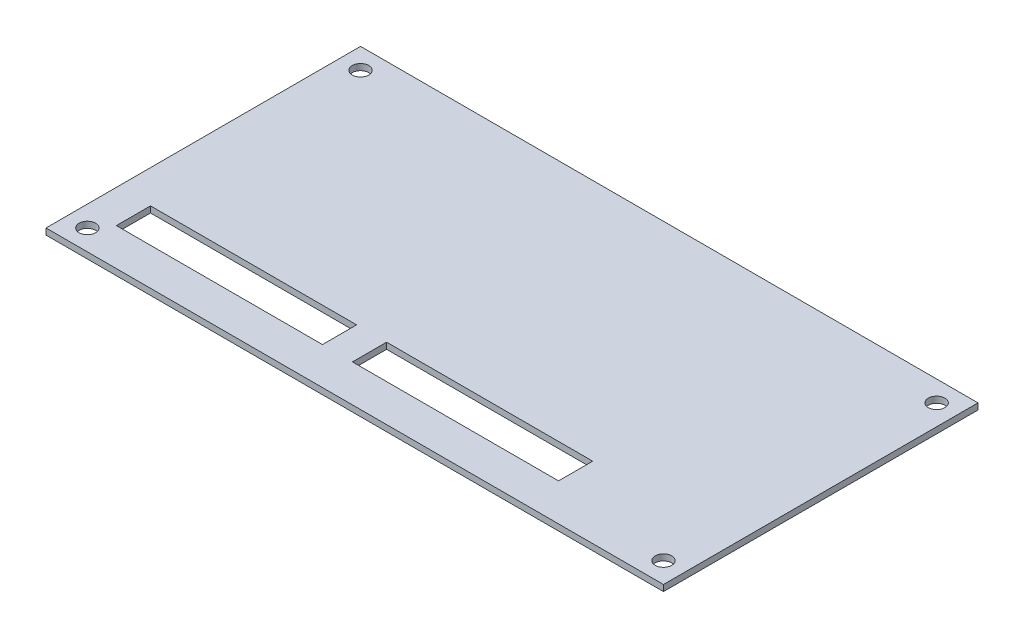
ISO-10303-21;
HEADER;
FILE_DESCRIPTION(('STEP AP214'),'2;1');
FILE_NAME('part.step','',(''),(''),'','','');
FILE_SCHEMA(('AUTOMOTIVE_DESIGN { 1 0 10303 214 1 1 1 1 }'));
ENDSEC;
DATA;
#1=APPLICATION_CONTEXT('core data for automotive mechanical design processes');
#2=APPLICATION_PROTOCOL_DEFINITION('international standard','automotive_design',2000,#1);
#3=PRODUCT_CONTEXT('',#1,'mechanical');
#4=PRODUCT('Part','Part','',(#3));
#5=PRODUCT_RELATED_PRODUCT_CATEGORY('part','',(#4));
#6=PRODUCT_DEFINITION_FORMATION('','',#4);
#7=PRODUCT_DEFINITION_CONTEXT('part definition',#1,'design');
#8=PRODUCT_DEFINITION('design','',#6,#7);
#9=PRODUCT_DEFINITION_SHAPE('','',#8);
#10=(LENGTH_UNIT() NAMED_UNIT(*) SI_UNIT(.MILLI.,.METRE.));
#11=(NAMED_UNIT(*) PLANE_ANGLE_UNIT() SI_UNIT($,.RADIAN.));
#12=(NAMED_UNIT(*) SI_UNIT($,.STERADIAN.) SOLID_ANGLE_UNIT());
#13=UNCERTAINTY_MEASURE_WITH_UNIT(LENGTH_MEASURE(1.E-05),#10,'distance_accuracy_value','');
#14=(GEOMETRIC_REPRESENTATION_CONTEXT(3) GLOBAL_UNCERTAINTY_ASSIGNED_CONTEXT((#13)) GLOBAL_UNIT_ASSIGNED_CONTEXT((#10,
#11,#12)) REPRESENTATION_CONTEXT('',''));
#15=CARTESIAN_POINT('',(0.,0.,0.));
#16=DIRECTION('',(0.,0.,1.));
#17=DIRECTION('',(1.,0.,0.));
#18=AXIS2_PLACEMENT_3D('',#15,#16,#17);
#19=CARTESIAN_POINT('',(74.6,-1.5,38.));
#20=DIRECTION('',(1.,0.,0.));
#21=DIRECTION('',(0.,0.,-1.));
#22=AXIS2_PLACEMENT_3D('',#19,#20,#21);
#23=PLANE('',#22);
#24=DIRECTION('',(0.,0.,-1.));
#25=VECTOR('',#24,1.);
#26=CARTESIAN_POINT('',(74.6,0.,38.));
#27=LINE('',#26,#25);
#28=CARTESIAN_POINT('',(74.6,0.,38.));
#29=VERTEX_POINT('',#28);
#30=CARTESIAN_POINT('',(74.6,0.,-38.));
#31=VERTEX_POINT('',#30);
#32=EDGE_CURVE('E254',#29,#31,#27,.T.);
#33=ORIENTED_EDGE('',*,*,#32,.F.);
#34=DIRECTION('',(0.,1.,0.));
#35=VECTOR('',#34,1.);
#36=CARTESIAN_POINT('',(74.6,-1.5,38.));
#37=LINE('',#36,#35);
#38=CARTESIAN_POINT('',(74.6,-1.5,38.));
#39=VERTEX_POINT('',#38);
#40=EDGE_CURVE('E11',#39,#29,#37,.T.);
#41=ORIENTED_EDGE('',*,*,#40,.F.);
#42=DIRECTION('',(0.,0.,-1.));
#43=VECTOR('',#42,1.);
#44=CARTESIAN_POINT('',(74.6,-1.5,38.));
#45=LINE('',#44,#43);
#46=CARTESIAN_POINT('',(74.6,-1.5,-38.));
#47=VERTEX_POINT('',#46);
#48=EDGE_CURVE('E258',#39,#47,#45,.T.);
#49=ORIENTED_EDGE('',*,*,#48,.T.);
#50=DIRECTION('',(0.,1.,0.));
#51=VECTOR('',#50,1.);
#52=CARTESIAN_POINT('',(74.6,-1.5,-38.));
#53=LINE('',#52,#51);
#54=EDGE_CURVE('E46',#47,#31,#53,.T.);
#55=ORIENTED_EDGE('',*,*,#54,.T.);
#56=EDGE_LOOP('',(#33,#41,#49,#55));
#57=FACE_BOUND('',#56,.T.);
#58=ADVANCED_FACE('F43',(#57),#23,.T.);
#59=CARTESIAN_POINT('',(-74.6,-1.5,38.));
#60=DIRECTION('',(0.,0.,1.));
#61=DIRECTION('',(1.,0.,0.));
#62=AXIS2_PLACEMENT_3D('',#59,#60,#61);
#63=PLANE('',#62);
#64=DIRECTION('',(1.,0.,0.));
#65=VECTOR('',#64,1.);
#66=CARTESIAN_POINT('',(-74.6,0.,38.));
#67=LINE('',#66,#65);
#68=CARTESIAN_POINT('',(-74.6,0.,38.));
#69=VERTEX_POINT('',#68);
#70=EDGE_CURVE('E263',#69,#29,#67,.T.);
#71=ORIENTED_EDGE('',*,*,#70,.F.);
#72=DIRECTION('',(0.,1.,0.));
#73=VECTOR('',#72,1.);
#74=CARTESIAN_POINT('',(-74.6,-1.5,38.));
#75=LINE('',#74,#73);
#76=CARTESIAN_POINT('',(-74.6,-1.5,38.));
#77=VERTEX_POINT('',#76);
#78=EDGE_CURVE('E52',#77,#69,#75,.T.);
#79=ORIENTED_EDGE('',*,*,#78,.F.);
#80=DIRECTION('',(1.,0.,0.));
#81=VECTOR('',#80,1.);
#82=CARTESIAN_POINT('',(-74.6,-1.5,38.));
#83=LINE('',#82,#81);
#84=EDGE_CURVE('E271',#77,#39,#83,.T.);
#85=ORIENTED_EDGE('',*,*,#84,.T.);
#86=ORIENTED_EDGE('',*,*,#40,.T.);
#87=EDGE_LOOP('',(#71,#79,#85,#86));
#88=FACE_BOUND('',#87,.T.);
#89=ADVANCED_FACE('F305',(#88),#63,.T.);
#90=CARTESIAN_POINT('',(-74.6,-1.5,38.));
#91=DIRECTION('',(-1.,0.,0.));
#92=DIRECTION('',(0.,0.,1.));
#93=AXIS2_PLACEMENT_3D('',#90,#91,#92);
#94=PLANE('',#93);
#95=DIRECTION('',(0.,0.,1.));
#96=VECTOR('',#95,1.);
#97=CARTESIAN_POINT('',(-74.6,0.,38.));
#98=LINE('',#97,#96);
#99=CARTESIAN_POINT('',(-74.6,0.,-38.));
#100=VERTEX_POINT('',#99);
#101=EDGE_CURVE('E282',#100,#69,#98,.T.);
#102=ORIENTED_EDGE('',*,*,#101,.F.);
#103=DIRECTION('',(0.,1.,0.));
#104=VECTOR('',#103,1.);
#105=CARTESIAN_POINT('',(-74.6,-1.5,-38.));
#106=LINE('',#105,#104);
#107=CARTESIAN_POINT('',(-74.6,-1.5,-38.));
#108=VERTEX_POINT('',#107);
#109=EDGE_CURVE('E290',#108,#100,#106,.T.);
#110=ORIENTED_EDGE('',*,*,#109,.F.);
#111=DIRECTION('',(0.,0.,1.));
#112=VECTOR('',#111,1.);
#113=CARTESIAN_POINT('',(-74.6,-1.5,38.));
#114=LINE('',#113,#112);
#115=EDGE_CURVE('E267',#108,#77,#114,.T.);
#116=ORIENTED_EDGE('',*,*,#115,.T.);
#117=ORIENTED_EDGE('',*,*,#78,.T.);
#118=EDGE_LOOP('',(#102,#110,#116,#117));
#119=FACE_BOUND('',#118,.T.);
#120=ADVANCED_FACE('F310',(#119),#94,.T.);
#121=CARTESIAN_POINT('',(-74.6,-1.5,-38.));
#122=DIRECTION('',(0.,0.,-1.));
#123=DIRECTION('',(-1.,0.,0.));
#124=AXIS2_PLACEMENT_3D('',#121,#122,#123);
#125=PLANE('',#124);
#126=DIRECTION('',(-1.,0.,0.));
#127=VECTOR('',#126,1.);
#128=CARTESIAN_POINT('',(-74.6,0.,-38.));
#129=LINE('',#128,#127);
#130=EDGE_CURVE('E278',#31,#100,#129,.T.);
#131=ORIENTED_EDGE('',*,*,#130,.F.);
#132=ORIENTED_EDGE('',*,*,#54,.F.);
#133=DIRECTION('',(-1.,0.,0.));
#134=VECTOR('',#133,1.);
#135=CARTESIAN_POINT('',(-74.6,-1.5,-38.));
#136=LINE('',#135,#134);
#137=EDGE_CURVE('E262',#47,#108,#136,.T.);
#138=ORIENTED_EDGE('',*,*,#137,.T.);
#139=ORIENTED_EDGE('',*,*,#109,.T.);
#140=EDGE_LOOP('',(#131,#132,#138,#139));
#141=FACE_BOUND('',#140,.T.);
#142=ADVANCED_FACE('F300',(#141),#125,.T.);
#143=CARTESIAN_POINT('',(0.,-1.5,0.));
#144=DIRECTION('',(0.,-1.,0.));
#145=DIRECTION('',(0.,0.,-1.));
#146=AXIS2_PLACEMENT_3D('',#143,#144,#145);
#147=PLANE('',#146);
#148=DIRECTION('',(0.,0.,-1.));
#149=VECTOR('',#148,1.);
#150=CARTESIAN_POINT('',(40.25,-1.5,29.));
#151=LINE('',#150,#149);
#152=CARTESIAN_POINT('',(40.25,-1.5,29.));
#153=VERTEX_POINT('',#152);
#154=CARTESIAN_POINT('',(40.25,-1.5,20.75));
#155=VERTEX_POINT('',#154);
#156=EDGE_CURVE('E135',#153,#155,#151,.T.);
#157=ORIENTED_EDGE('',*,*,#156,.T.);
#158=DIRECTION('',(-1.,0.,0.));
#159=VECTOR('',#158,1.);
#160=CARTESIAN_POINT('',(-9.55,-1.5,20.75));
#161=LINE('',#160,#159);
#162=CARTESIAN_POINT('',(-9.55,-1.5,20.75));
#163=VERTEX_POINT('',#162);
#164=EDGE_CURVE('E145',#155,#163,#161,.T.);
#165=ORIENTED_EDGE('',*,*,#164,.T.);
#166=DIRECTION('',(0.,0.,1.));
#167=VECTOR('',#166,1.);
#168=CARTESIAN_POINT('',(-9.55,-1.5,29.));
#169=LINE('',#168,#167);
#170=CARTESIAN_POINT('',(-9.55,-1.5,29.));
#171=VERTEX_POINT('',#170);
#172=EDGE_CURVE('E60',#163,#171,#169,.T.);
#173=ORIENTED_EDGE('',*,*,#172,.T.);
#174=DIRECTION('',(1.,0.,0.));
#175=VECTOR('',#174,1.);
#176=CARTESIAN_POINT('',(-9.55,-1.5,29.));
#177=LINE('',#176,#175);
#178=EDGE_CURVE('E142',#171,#153,#177,.T.);
#179=ORIENTED_EDGE('',*,*,#178,.T.);
#180=EDGE_LOOP('',(#157,#165,#173,#179));
#181=FACE_BOUND('',#180,.T.);
#182=DIRECTION('',(0.,0.,-1.));
#183=VECTOR('',#182,1.);
#184=CARTESIAN_POINT('',(-16.8,-1.5,29.));
#185=LINE('',#184,#183);
#186=CARTESIAN_POINT('',(-16.8,-1.5,29.));
#187=VERTEX_POINT('',#186);
#188=CARTESIAN_POINT('',(-16.8,-1.5,20.75));
#189=VERTEX_POINT('',#188);
#190=EDGE_CURVE('E182',#187,#189,#185,.T.);
#191=ORIENTED_EDGE('',*,*,#190,.T.);
#192=DIRECTION('',(-1.,0.,0.));
#193=VECTOR('',#192,1.);
#194=CARTESIAN_POINT('',(-66.6,-1.5,20.75));
#195=LINE('',#194,#193);
#196=CARTESIAN_POINT('',(-66.6,-1.5,20.75));
#197=VERTEX_POINT('',#196);
#198=EDGE_CURVE('E186',#189,#197,#195,.T.);
#199=ORIENTED_EDGE('',*,*,#198,.T.);
#200=DIRECTION('',(0.,0.,1.));
#201=VECTOR('',#200,1.);
#202=CARTESIAN_POINT('',(-66.6,-1.5,29.));
#203=LINE('',#202,#201);
#204=CARTESIAN_POINT('',(-66.6,-1.5,29.));
#205=VERTEX_POINT('',#204);
#206=EDGE_CURVE('E191',#197,#205,#203,.T.);
#207=ORIENTED_EDGE('',*,*,#206,.T.);
#208=DIRECTION('',(1.,0.,0.));
#209=VECTOR('',#208,1.);
#210=CARTESIAN_POINT('',(-66.6,-1.5,29.));
#211=LINE('',#210,#209);
#212=EDGE_CURVE('E195',#205,#187,#211,.T.);
#213=ORIENTED_EDGE('',*,*,#212,.T.);
#214=EDGE_LOOP('',(#191,#199,#207,#213));
#215=FACE_BOUND('',#214,.T.);
#216=CARTESIAN_POINT('',(-69.6,-1.5,33.));
#217=DIRECTION('',(0.,1.,0.));
#218=DIRECTION('',(0.,0.,1.));
#219=AXIS2_PLACEMENT_3D('',#216,#217,#218);
#220=CIRCLE('',#219,2.);
#221=CARTESIAN_POINT('',(-69.6,-1.5,35.));
#222=VERTEX_POINT('',#221);
#223=EDGE_CURVE('E226',#222,#222,#220,.T.);
#224=ORIENTED_EDGE('',*,*,#223,.T.);
#225=EDGE_LOOP('',(#224));
#226=FACE_BOUND('',#225,.T.);
#227=CARTESIAN_POINT('',(69.6,-1.5,33.));
#228=DIRECTION('',(0.,1.,0.));
#229=DIRECTION('',(0.,0.,1.));
#230=AXIS2_PLACEMENT_3D('',#227,#228,#229);
#231=CIRCLE('',#230,2.);
#232=CARTESIAN_POINT('',(69.6,-1.5,35.));
#233=VERTEX_POINT('',#232);
#234=EDGE_CURVE('E234',#233,#233,#231,.T.);
#235=ORIENTED_EDGE('',*,*,#234,.T.);
#236=EDGE_LOOP('',(#235));
#237=FACE_BOUND('',#236,.T.);
#238=CARTESIAN_POINT('',(69.6,-1.5,-33.));
#239=DIRECTION('',(0.,1.,0.));
#240=DIRECTION('',(0.,0.,1.));
#241=AXIS2_PLACEMENT_3D('',#238,#239,#240);
#242=CIRCLE('',#241,2.);
#243=CARTESIAN_POINT('',(69.6,-1.5,-31.));
#244=VERTEX_POINT('',#243);
#245=EDGE_CURVE('E242',#244,#244,#242,.T.);
#246=ORIENTED_EDGE('',*,*,#245,.T.);
#247=EDGE_LOOP('',(#246));
#248=FACE_BOUND('',#247,.T.);
#249=CARTESIAN_POINT('',(-69.6,-1.5,-33.));
#250=DIRECTION('',(0.,1.,0.));
#251=DIRECTION('',(0.,0.,1.));
#252=AXIS2_PLACEMENT_3D('',#249,#250,#251);
#253=CIRCLE('',#252,2.);
#254=CARTESIAN_POINT('',(-69.6,-1.5,-31.));
#255=VERTEX_POINT('',#254);
#256=EDGE_CURVE('E250',#255,#255,#253,.T.);
#257=ORIENTED_EDGE('',*,*,#256,.T.);
#258=EDGE_LOOP('',(#257));
#259=FACE_BOUND('',#258,.T.);
#260=ORIENTED_EDGE('',*,*,#48,.F.);
#261=ORIENTED_EDGE('',*,*,#84,.F.);
#262=ORIENTED_EDGE('',*,*,#115,.F.);
#263=ORIENTED_EDGE('',*,*,#137,.F.);
#264=EDGE_LOOP('',(#260,#261,#262,#263));
#265=FACE_BOUND('',#264,.T.);
#266=ADVANCED_FACE('F150',(#181,#215,#226,#237,#248,#259,#265),#147,.T.);
#267=CARTESIAN_POINT('',(0.,0.,0.));
#268=DIRECTION('',(0.,-1.,0.));
#269=DIRECTION('',(0.,0.,-1.));
#270=AXIS2_PLACEMENT_3D('',#267,#268,#269);
#271=PLANE('',#270);
#272=DIRECTION('',(-1.,0.,0.));
#273=VECTOR('',#272,1.);
#274=CARTESIAN_POINT('',(-9.55,0.,20.75));
#275=LINE('',#274,#273);
#276=CARTESIAN_POINT('',(40.25,0.,20.75));
#277=VERTEX_POINT('',#276);
#278=CARTESIAN_POINT('',(-9.55,0.,20.75));
#279=VERTEX_POINT('',#278);
#280=EDGE_CURVE('E167',#277,#279,#275,.T.);
#281=ORIENTED_EDGE('',*,*,#280,.F.);
#282=DIRECTION('',(0.,0.,-1.));
#283=VECTOR('',#282,1.);
#284=CARTESIAN_POINT('',(40.25,0.,29.));
#285=LINE('',#284,#283);
#286=CARTESIAN_POINT('',(40.25,0.,29.));
#287=VERTEX_POINT('',#286);
#288=EDGE_CURVE('E68',#287,#277,#285,.T.);
#289=ORIENTED_EDGE('',*,*,#288,.F.);
#290=DIRECTION('',(1.,0.,0.));
#291=VECTOR('',#290,1.);
#292=CARTESIAN_POINT('',(-9.55,0.,29.));
#293=LINE('',#292,#291);
#294=CARTESIAN_POINT('',(-9.55,0.,29.));
#295=VERTEX_POINT('',#294);
#296=EDGE_CURVE('E154',#295,#287,#293,.T.);
#297=ORIENTED_EDGE('',*,*,#296,.F.);
#298=DIRECTION('',(0.,0.,1.));
#299=VECTOR('',#298,1.);
#300=CARTESIAN_POINT('',(-9.55,0.,29.));
#301=LINE('',#300,#299);
#302=EDGE_CURVE('E158',#279,#295,#301,.T.);
#303=ORIENTED_EDGE('',*,*,#302,.F.);
#304=EDGE_LOOP('',(#281,#289,#297,#303));
#305=FACE_BOUND('',#304,.T.);
#306=DIRECTION('',(-1.,0.,0.));
#307=VECTOR('',#306,1.);
#308=CARTESIAN_POINT('',(-66.6,0.,20.75));
#309=LINE('',#308,#307);
#310=CARTESIAN_POINT('',(-16.8,0.,20.75));
#311=VERTEX_POINT('',#310);
#312=CARTESIAN_POINT('',(-66.6,0.,20.75));
#313=VERTEX_POINT('',#312);
#314=EDGE_CURVE('E202',#311,#313,#309,.T.);
#315=ORIENTED_EDGE('',*,*,#314,.F.);
#316=DIRECTION('',(0.,0.,-1.));
#317=VECTOR('',#316,1.);
#318=CARTESIAN_POINT('',(-16.8,0.,29.));
#319=LINE('',#318,#317);
#320=CARTESIAN_POINT('',(-16.8,0.,29.));
#321=VERTEX_POINT('',#320);
#322=EDGE_CURVE('E176',#321,#311,#319,.T.);
#323=ORIENTED_EDGE('',*,*,#322,.F.);
#324=DIRECTION('',(1.,0.,0.));
#325=VECTOR('',#324,1.);
#326=CARTESIAN_POINT('',(-66.6,0.,29.));
#327=LINE('',#326,#325);
#328=CARTESIAN_POINT('',(-66.6,0.,29.));
#329=VERTEX_POINT('',#328);
#330=EDGE_CURVE('E187',#329,#321,#327,.T.);
#331=ORIENTED_EDGE('',*,*,#330,.F.);
#332=DIRECTION('',(0.,0.,1.));
#333=VECTOR('',#332,1.);
#334=CARTESIAN_POINT('',(-66.6,0.,29.));
#335=LINE('',#334,#333);
#336=EDGE_CURVE('E206',#313,#329,#335,.T.);
#337=ORIENTED_EDGE('',*,*,#336,.F.);
#338=EDGE_LOOP('',(#315,#323,#331,#337));
#339=FACE_BOUND('',#338,.T.);
#340=CARTESIAN_POINT('',(-69.6,0.,33.));
#341=DIRECTION('',(0.,1.,0.));
#342=DIRECTION('',(0.,0.,1.));
#343=AXIS2_PLACEMENT_3D('',#340,#341,#342);
#344=CIRCLE('',#343,2.);
#345=CARTESIAN_POINT('',(-69.6,0.,35.));
#346=VERTEX_POINT('',#345);
#347=EDGE_CURVE('E216',#346,#346,#344,.T.);
#348=ORIENTED_EDGE('',*,*,#347,.F.);
#349=EDGE_LOOP('',(#348));
#350=FACE_BOUND('',#349,.T.);
#351=CARTESIAN_POINT('',(69.6,0.,33.));
#352=DIRECTION('',(0.,1.,0.));
#353=DIRECTION('',(0.,0.,1.));
#354=AXIS2_PLACEMENT_3D('',#351,#352,#353);
#355=CIRCLE('',#354,2.);
#356=CARTESIAN_POINT('',(69.6,0.,35.));
#357=VERTEX_POINT('',#356);
#358=EDGE_CURVE('E230',#357,#357,#355,.T.);
#359=ORIENTED_EDGE('',*,*,#358,.F.);
#360=EDGE_LOOP('',(#359));
#361=FACE_BOUND('',#360,.T.);
#362=CARTESIAN_POINT('',(69.6,0.,-33.));
#363=DIRECTION('',(0.,1.,0.));
#364=DIRECTION('',(0.,0.,1.));
#365=AXIS2_PLACEMENT_3D('',#362,#363,#364);
#366=CIRCLE('',#365,2.);
#367=CARTESIAN_POINT('',(69.6,0.,-31.));
#368=VERTEX_POINT('',#367);
#369=EDGE_CURVE('E238',#368,#368,#366,.T.);
#370=ORIENTED_EDGE('',*,*,#369,.F.);
#371=EDGE_LOOP('',(#370));
#372=FACE_BOUND('',#371,.T.);
#373=CARTESIAN_POINT('',(-69.6,0.,-33.));
#374=DIRECTION('',(0.,1.,0.));
#375=DIRECTION('',(0.,0.,1.));
#376=AXIS2_PLACEMENT_3D('',#373,#374,#375);
#377=CIRCLE('',#376,2.);
#378=CARTESIAN_POINT('',(-69.6,0.,-31.));
#379=VERTEX_POINT('',#378);
#380=EDGE_CURVE('E246',#379,#379,#377,.T.);
#381=ORIENTED_EDGE('',*,*,#380,.F.);
#382=EDGE_LOOP('',(#381));
#383=FACE_BOUND('',#382,.T.);
#384=ORIENTED_EDGE('',*,*,#32,.T.);
#385=ORIENTED_EDGE('',*,*,#130,.T.);
#386=ORIENTED_EDGE('',*,*,#101,.T.);
#387=ORIENTED_EDGE('',*,*,#70,.T.);
#388=EDGE_LOOP('',(#384,#385,#386,#387));
#389=FACE_BOUND('',#388,.T.);
#390=ADVANCED_FACE('F302',(#305,#339,#350,#361,#372,#383,#389),#271,.F.);
#391=CARTESIAN_POINT('',(-69.6,-1.5,-33.));
#392=DIRECTION('',(0.,1.,0.));
#393=DIRECTION('',(0.,0.,1.));
#394=AXIS2_PLACEMENT_3D('',#391,#392,#393);
#395=CYLINDRICAL_SURFACE('',#394,2.);
#396=ORIENTED_EDGE('',*,*,#256,.F.);
#397=EDGE_LOOP('',(#396));
#398=FACE_BOUND('',#397,.T.);
#399=ORIENTED_EDGE('',*,*,#380,.T.);
#400=EDGE_LOOP('',(#399));
#401=FACE_BOUND('',#400,.T.);
#402=ADVANCED_FACE('F356',(#398,#401),#395,.F.);
#403=CARTESIAN_POINT('',(69.6,-1.5,-33.));
#404=DIRECTION('',(0.,1.,0.));
#405=DIRECTION('',(0.,0.,1.));
#406=AXIS2_PLACEMENT_3D('',#403,#404,#405);
#407=CYLINDRICAL_SURFACE('',#406,2.);
#408=ORIENTED_EDGE('',*,*,#245,.F.);
#409=EDGE_LOOP('',(#408));
#410=FACE_BOUND('',#409,.T.);
#411=ORIENTED_EDGE('',*,*,#369,.T.);
#412=EDGE_LOOP('',(#411));
#413=FACE_BOUND('',#412,.T.);
#414=ADVANCED_FACE('F367',(#410,#413),#407,.F.);
#415=CARTESIAN_POINT('',(69.6,-1.5,33.));
#416=DIRECTION('',(0.,1.,0.));
#417=DIRECTION('',(0.,0.,1.));
#418=AXIS2_PLACEMENT_3D('',#415,#416,#417);
#419=CYLINDRICAL_SURFACE('',#418,2.);
#420=ORIENTED_EDGE('',*,*,#234,.F.);
#421=EDGE_LOOP('',(#420));
#422=FACE_BOUND('',#421,.T.);
#423=ORIENTED_EDGE('',*,*,#358,.T.);
#424=EDGE_LOOP('',(#423));
#425=FACE_BOUND('',#424,.T.);
#426=ADVANCED_FACE('F378',(#422,#425),#419,.F.);
#427=CARTESIAN_POINT('',(-69.6,-1.5,33.));
#428=DIRECTION('',(0.,1.,0.));
#429=DIRECTION('',(0.,0.,1.));
#430=AXIS2_PLACEMENT_3D('',#427,#428,#429);
#431=CYLINDRICAL_SURFACE('',#430,2.);
#432=ORIENTED_EDGE('',*,*,#223,.F.);
#433=EDGE_LOOP('',(#432));
#434=FACE_BOUND('',#433,.T.);
#435=ORIENTED_EDGE('',*,*,#347,.T.);
#436=EDGE_LOOP('',(#435));
#437=FACE_BOUND('',#436,.T.);
#438=ADVANCED_FACE('F389',(#434,#437),#431,.F.);
#439=CARTESIAN_POINT('',(-16.8,-1.5,29.));
#440=DIRECTION('',(1.,0.,0.));
#441=DIRECTION('',(0.,0.,-1.));
#442=AXIS2_PLACEMENT_3D('',#439,#440,#441);
#443=PLANE('',#442);
#444=ORIENTED_EDGE('',*,*,#322,.T.);
#445=DIRECTION('',(0.,1.,0.));
#446=VECTOR('',#445,1.);
#447=CARTESIAN_POINT('',(-16.8,-1.5,20.75));
#448=LINE('',#447,#446);
#449=EDGE_CURVE('E199',#189,#311,#448,.T.);
#450=ORIENTED_EDGE('',*,*,#449,.F.);
#451=ORIENTED_EDGE('',*,*,#190,.F.);
#452=DIRECTION('',(0.,1.,0.));
#453=VECTOR('',#452,1.);
#454=CARTESIAN_POINT('',(-16.8,-1.5,29.));
#455=LINE('',#454,#453);
#456=EDGE_CURVE('E213',#187,#321,#455,.T.);
#457=ORIENTED_EDGE('',*,*,#456,.T.);
#458=EDGE_LOOP('',(#444,#450,#451,#457));
#459=FACE_BOUND('',#458,.T.);
#460=ADVANCED_FACE('F400',(#459),#443,.F.);
#461=CARTESIAN_POINT('',(-66.6,-1.5,29.));
#462=DIRECTION('',(0.,0.,1.));
#463=DIRECTION('',(1.,0.,0.));
#464=AXIS2_PLACEMENT_3D('',#461,#462,#463);
#465=PLANE('',#464);
#466=ORIENTED_EDGE('',*,*,#330,.T.);
#467=ORIENTED_EDGE('',*,*,#456,.F.);
#468=ORIENTED_EDGE('',*,*,#212,.F.);
#469=DIRECTION('',(0.,1.,0.));
#470=VECTOR('',#469,1.);
#471=CARTESIAN_POINT('',(-66.6,-1.5,29.));
#472=LINE('',#471,#470);
#473=EDGE_CURVE('E217',#205,#329,#472,.T.);
#474=ORIENTED_EDGE('',*,*,#473,.T.);
#475=EDGE_LOOP('',(#466,#467,#468,#474));
#476=FACE_BOUND('',#475,.T.);
#477=ADVANCED_FACE('F411',(#476),#465,.F.);
#478=CARTESIAN_POINT('',(-66.6,-1.5,29.));
#479=DIRECTION('',(-1.,0.,0.));
#480=DIRECTION('',(0.,0.,1.));
#481=AXIS2_PLACEMENT_3D('',#478,#479,#480);
#482=PLANE('',#481);
#483=ORIENTED_EDGE('',*,*,#336,.T.);
#484=ORIENTED_EDGE('',*,*,#473,.F.);
#485=ORIENTED_EDGE('',*,*,#206,.F.);
#486=DIRECTION('',(0.,1.,0.));
#487=VECTOR('',#486,1.);
#488=CARTESIAN_POINT('',(-66.6,-1.5,20.75));
#489=LINE('',#488,#487);
#490=EDGE_CURVE('E220',#197,#313,#489,.T.);
#491=ORIENTED_EDGE('',*,*,#490,.T.);
#492=EDGE_LOOP('',(#483,#484,#485,#491));
#493=FACE_BOUND('',#492,.T.);
#494=ADVANCED_FACE('F422',(#493),#482,.F.);
#495=CARTESIAN_POINT('',(-66.6,-1.5,20.75));
#496=DIRECTION('',(0.,0.,-1.));
#497=DIRECTION('',(-1.,0.,0.));
#498=AXIS2_PLACEMENT_3D('',#495,#496,#497);
#499=PLANE('',#498);
#500=ORIENTED_EDGE('',*,*,#314,.T.);
#501=ORIENTED_EDGE('',*,*,#490,.F.);
#502=ORIENTED_EDGE('',*,*,#198,.F.);
#503=ORIENTED_EDGE('',*,*,#449,.T.);
#504=EDGE_LOOP('',(#500,#501,#502,#503));
#505=FACE_BOUND('',#504,.T.);
#506=ADVANCED_FACE('F433',(#505),#499,.F.);
#507=CARTESIAN_POINT('',(40.25,-1.5,29.));
#508=DIRECTION('',(1.,0.,0.));
#509=DIRECTION('',(0.,0.,-1.));
#510=AXIS2_PLACEMENT_3D('',#507,#508,#509);
#511=PLANE('',#510);
#512=ORIENTED_EDGE('',*,*,#288,.T.);
#513=DIRECTION('',(0.,1.,0.));
#514=VECTOR('',#513,1.);
#515=CARTESIAN_POINT('',(40.25,-1.5,20.75));
#516=LINE('',#515,#514);
#517=EDGE_CURVE('E131',#155,#277,#516,.T.);
#518=ORIENTED_EDGE('',*,*,#517,.F.);
#519=ORIENTED_EDGE('',*,*,#156,.F.);
#520=DIRECTION('',(0.,1.,0.));
#521=VECTOR('',#520,1.);
#522=CARTESIAN_POINT('',(40.25,-1.5,29.));
#523=LINE('',#522,#521);
#524=EDGE_CURVE('E173',#153,#287,#523,.T.);
#525=ORIENTED_EDGE('',*,*,#524,.T.);
#526=EDGE_LOOP('',(#512,#518,#519,#525));
#527=FACE_BOUND('',#526,.T.);
#528=ADVANCED_FACE('F133',(#527),#511,.F.);
#529=CARTESIAN_POINT('',(-9.55,-1.5,29.));
#530=DIRECTION('',(0.,0.,1.));
#531=DIRECTION('',(1.,0.,0.));
#532=AXIS2_PLACEMENT_3D('',#529,#530,#531);
#533=PLANE('',#532);
#534=ORIENTED_EDGE('',*,*,#296,.T.);
#535=ORIENTED_EDGE('',*,*,#524,.F.);
#536=ORIENTED_EDGE('',*,*,#178,.F.);
#537=DIRECTION('',(0.,1.,0.));
#538=VECTOR('',#537,1.);
#539=CARTESIAN_POINT('',(-9.55,-1.5,29.));
#540=LINE('',#539,#538);
#541=EDGE_CURVE('E177',#171,#295,#540,.T.);
#542=ORIENTED_EDGE('',*,*,#541,.T.);
#543=EDGE_LOOP('',(#534,#535,#536,#542));
#544=FACE_BOUND('',#543,.T.);
#545=ADVANCED_FACE('F454',(#544),#533,.F.);
#546=CARTESIAN_POINT('',(-9.55,-1.5,29.));
#547=DIRECTION('',(-1.,0.,0.));
#548=DIRECTION('',(0.,0.,1.));
#549=AXIS2_PLACEMENT_3D('',#546,#547,#548);
#550=PLANE('',#549);
#551=ORIENTED_EDGE('',*,*,#302,.T.);
#552=ORIENTED_EDGE('',*,*,#541,.F.);
#553=ORIENTED_EDGE('',*,*,#172,.F.);
#554=DIRECTION('',(0.,1.,0.));
#555=VECTOR('',#554,1.);
#556=CARTESIAN_POINT('',(-9.55,-1.5,20.75));
#557=LINE('',#556,#555);
#558=EDGE_CURVE('E141',#163,#279,#557,.T.);
#559=ORIENTED_EDGE('',*,*,#558,.T.);
#560=EDGE_LOOP('',(#551,#552,#553,#559));
#561=FACE_BOUND('',#560,.T.);
#562=ADVANCED_FACE('F464',(#561),#550,.F.);
#563=CARTESIAN_POINT('',(-9.55,-1.5,20.75));
#564=DIRECTION('',(0.,0.,-1.));
#565=DIRECTION('',(-1.,0.,0.));
#566=AXIS2_PLACEMENT_3D('',#563,#564,#565);
#567=PLANE('',#566);
#568=ORIENTED_EDGE('',*,*,#280,.T.);
#569=ORIENTED_EDGE('',*,*,#558,.F.);
#570=ORIENTED_EDGE('',*,*,#164,.F.);
#571=ORIENTED_EDGE('',*,*,#517,.T.);
#572=EDGE_LOOP('',(#568,#569,#570,#571));
#573=FACE_BOUND('',#572,.T.);
#574=ADVANCED_FACE('F146',(#573),#567,.F.);
#575=CLOSED_SHELL('',(#58,#89,#120,#142,#266,#390,#402,#414,#426,#438,#460,#477,#494,#506,#528,
#545,#562,#574));
#576=MANIFOLD_SOLID_BREP('B2',#575);
#577=ADVANCED_BREP_SHAPE_REPRESENTATION('',(#18,#576),#14);
#578=SHAPE_DEFINITION_REPRESENTATION(#9,#577);
ENDSEC;
END-ISO-10303-21;
